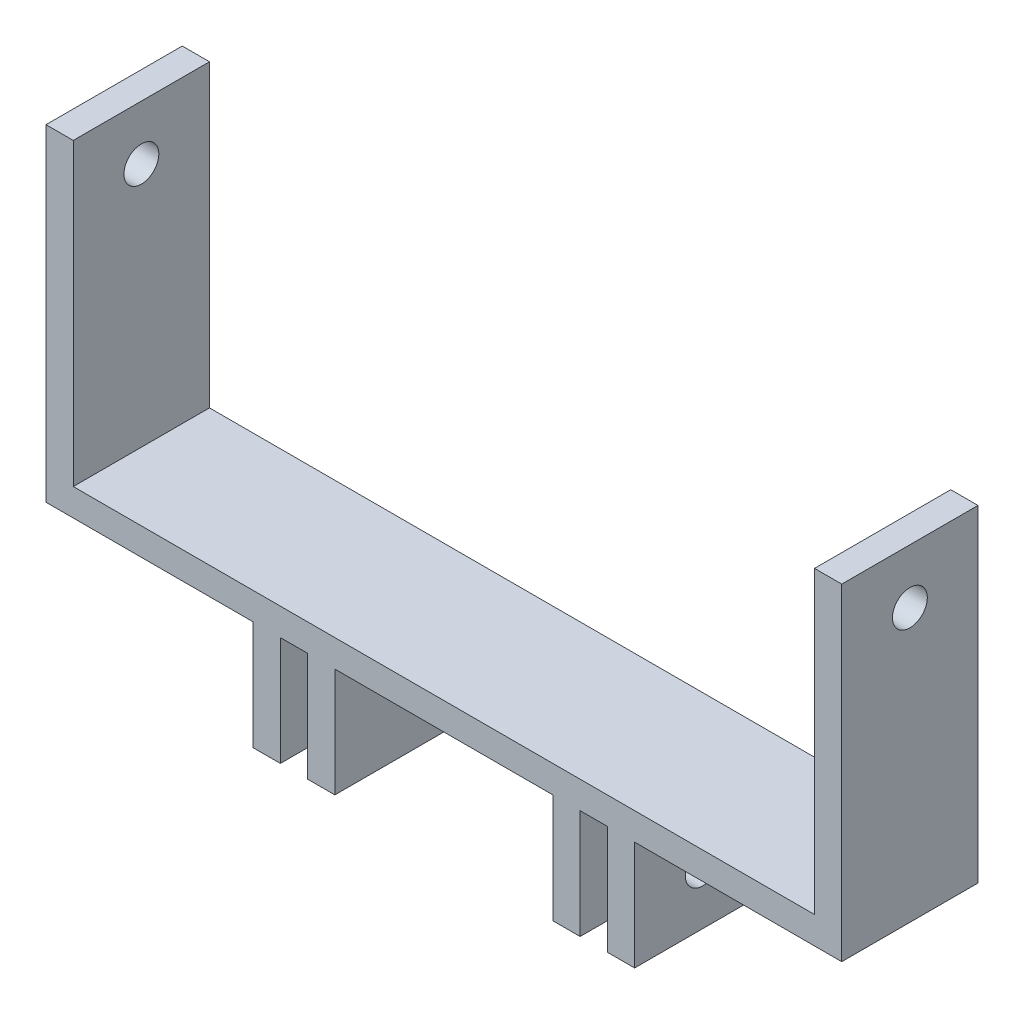
ISO-10303-21;
HEADER;
FILE_DESCRIPTION(('STEP AP214'),'2;1');
FILE_NAME('part.step','',(''),(''),'','','');
FILE_SCHEMA(('AUTOMOTIVE_DESIGN { 1 0 10303 214 1 1 1 1 }'));
ENDSEC;
DATA;
#1=APPLICATION_CONTEXT('core data for automotive mechanical design processes');
#2=APPLICATION_PROTOCOL_DEFINITION('international standard','automotive_design',2000,#1);
#3=PRODUCT_CONTEXT('',#1,'mechanical');
#4=PRODUCT('Part','Part','',(#3));
#5=PRODUCT_RELATED_PRODUCT_CATEGORY('part','',(#4));
#6=PRODUCT_DEFINITION_FORMATION('','',#4);
#7=PRODUCT_DEFINITION_CONTEXT('part definition',#1,'design');
#8=PRODUCT_DEFINITION('design','',#6,#7);
#9=PRODUCT_DEFINITION_SHAPE('','',#8);
#10=(LENGTH_UNIT() NAMED_UNIT(*) SI_UNIT(.MILLI.,.METRE.));
#11=(NAMED_UNIT(*) PLANE_ANGLE_UNIT() SI_UNIT($,.RADIAN.));
#12=(NAMED_UNIT(*) SI_UNIT($,.STERADIAN.) SOLID_ANGLE_UNIT());
#13=UNCERTAINTY_MEASURE_WITH_UNIT(LENGTH_MEASURE(1.E-05),#10,'distance_accuracy_value','');
#14=(GEOMETRIC_REPRESENTATION_CONTEXT(3) GLOBAL_UNCERTAINTY_ASSIGNED_CONTEXT((#13)) GLOBAL_UNIT_ASSIGNED_CONTEXT((#10,
#11,#12)) REPRESENTATION_CONTEXT('',''));
#15=CARTESIAN_POINT('',(0.,0.,0.));
#16=DIRECTION('',(0.,0.,1.));
#17=DIRECTION('',(1.,0.,0.));
#18=AXIS2_PLACEMENT_3D('',#15,#16,#17);
#19=CARTESIAN_POINT('',(92.71,0.,15.875));
#20=DIRECTION('',(1.,0.,0.));
#21=DIRECTION('',(0.,0.,-1.));
#22=AXIS2_PLACEMENT_3D('',#19,#20,#21);
#23=PLANE('',#22);
#24=DIRECTION('',(0.,-1.,0.));
#25=VECTOR('',#24,1.);
#26=CARTESIAN_POINT('',(92.71,0.,0.));
#27=LINE('',#26,#25);
#28=CARTESIAN_POINT('',(92.71,38.1,0.));
#29=VERTEX_POINT('',#28);
#30=CARTESIAN_POINT('',(92.71,0.,0.));
#31=VERTEX_POINT('',#30);
#32=EDGE_CURVE('E301',#29,#31,#27,.T.);
#33=ORIENTED_EDGE('',*,*,#32,.F.);
#34=DIRECTION('',(0.,0.,-1.));
#35=VECTOR('',#34,1.);
#36=CARTESIAN_POINT('',(92.71,38.1,15.875));
#37=LINE('',#36,#35);
#38=CARTESIAN_POINT('',(92.71,38.1,15.875));
#39=VERTEX_POINT('',#38);
#40=EDGE_CURVE('E360',#39,#29,#37,.T.);
#41=ORIENTED_EDGE('',*,*,#40,.F.);
#42=DIRECTION('',(0.,-1.,0.));
#43=VECTOR('',#42,1.);
#44=CARTESIAN_POINT('',(92.71,0.,15.875));
#45=LINE('',#44,#43);
#46=CARTESIAN_POINT('',(92.71,0.,15.875));
#47=VERTEX_POINT('',#46);
#48=EDGE_CURVE('E334',#39,#47,#45,.T.);
#49=ORIENTED_EDGE('',*,*,#48,.T.);
#50=DIRECTION('',(0.,0.,-1.));
#51=VECTOR('',#50,1.);
#52=CARTESIAN_POINT('',(92.71,0.,15.875));
#53=LINE('',#52,#51);
#54=EDGE_CURVE('E300',#47,#31,#53,.T.);
#55=ORIENTED_EDGE('',*,*,#54,.T.);
#56=EDGE_LOOP('',(#33,#41,#49,#55));
#57=FACE_BOUND('',#56,.T.);
#58=CARTESIAN_POINT('',(92.71,31.75,7.93749999999999));
#59=DIRECTION('',(-1.,0.,0.));
#60=DIRECTION('',(0.,0.,1.));
#61=AXIS2_PLACEMENT_3D('',#58,#59,#60);
#62=CIRCLE('',#61,2.032);
#63=CARTESIAN_POINT('',(92.71,31.75,9.96949999999999));
#64=VERTEX_POINT('',#63);
#65=EDGE_CURVE('E761',#64,#64,#62,.T.);
#66=ORIENTED_EDGE('',*,*,#65,.T.);
#67=EDGE_LOOP('',(#66));
#68=FACE_BOUND('',#67,.T.);
#69=ADVANCED_FACE('F35',(#57,#68),#23,.T.);
#70=CARTESIAN_POINT('',(89.535,3.175,15.875));
#71=DIRECTION('',(-1.,0.,0.));
#72=DIRECTION('',(0.,0.,1.));
#73=AXIS2_PLACEMENT_3D('',#70,#71,#72);
#74=PLANE('',#73);
#75=DIRECTION('',(0.,1.,0.));
#76=VECTOR('',#75,1.);
#77=CARTESIAN_POINT('',(89.535,3.175,0.));
#78=LINE('',#77,#76);
#79=CARTESIAN_POINT('',(89.535,3.175,0.));
#80=VERTEX_POINT('',#79);
#81=CARTESIAN_POINT('',(89.535,38.1,0.));
#82=VERTEX_POINT('',#81);
#83=EDGE_CURVE('E308',#80,#82,#78,.T.);
#84=ORIENTED_EDGE('',*,*,#83,.F.);
#85=DIRECTION('',(0.,0.,-1.));
#86=VECTOR('',#85,1.);
#87=CARTESIAN_POINT('',(89.535,3.175,15.875));
#88=LINE('',#87,#86);
#89=CARTESIAN_POINT('',(89.535,3.175,15.875));
#90=VERTEX_POINT('',#89);
#91=EDGE_CURVE('E269',#90,#80,#88,.T.);
#92=ORIENTED_EDGE('',*,*,#91,.F.);
#93=DIRECTION('',(0.,1.,0.));
#94=VECTOR('',#93,1.);
#95=CARTESIAN_POINT('',(89.535,3.175,15.875));
#96=LINE('',#95,#94);
#97=CARTESIAN_POINT('',(89.535,38.1,15.875));
#98=VERTEX_POINT('',#97);
#99=EDGE_CURVE('E145',#90,#98,#96,.T.);
#100=ORIENTED_EDGE('',*,*,#99,.T.);
#101=DIRECTION('',(0.,0.,-1.));
#102=VECTOR('',#101,1.);
#103=CARTESIAN_POINT('',(89.535,38.1,15.875));
#104=LINE('',#103,#102);
#105=EDGE_CURVE('E357',#98,#82,#104,.T.);
#106=ORIENTED_EDGE('',*,*,#105,.T.);
#107=EDGE_LOOP('',(#84,#92,#100,#106));
#108=FACE_BOUND('',#107,.T.);
#109=CARTESIAN_POINT('',(89.535,31.75,7.93749999999999));
#110=DIRECTION('',(-1.,0.,0.));
#111=DIRECTION('',(0.,0.,1.));
#112=AXIS2_PLACEMENT_3D('',#109,#110,#111);
#113=CIRCLE('',#112,2.032);
#114=CARTESIAN_POINT('',(89.535,31.75,9.96949999999999));
#115=VERTEX_POINT('',#114);
#116=EDGE_CURVE('E681',#115,#115,#113,.T.);
#117=ORIENTED_EDGE('',*,*,#116,.F.);
#118=EDGE_LOOP('',(#117));
#119=FACE_BOUND('',#118,.T.);
#120=ADVANCED_FACE('F389',(#108,#119),#74,.T.);
#121=CARTESIAN_POINT('',(65.405,-12.7,15.875));
#122=DIRECTION('',(-1.,0.,0.));
#123=DIRECTION('',(0.,-1.,0.));
#124=AXIS2_PLACEMENT_3D('',#121,#122,#123);
#125=PLANE('',#124);
#126=DIRECTION('',(0.,1.,0.));
#127=VECTOR('',#126,1.);
#128=CARTESIAN_POINT('',(65.405,-12.7,0.));
#129=LINE('',#128,#127);
#130=CARTESIAN_POINT('',(65.405,-12.7,0.));
#131=VERTEX_POINT('',#130);
#132=CARTESIAN_POINT('',(65.405,0.,0.));
#133=VERTEX_POINT('',#132);
#134=EDGE_CURVE('E322',#131,#133,#129,.T.);
#135=ORIENTED_EDGE('',*,*,#134,.F.);
#136=DIRECTION('',(0.,0.,-1.));
#137=VECTOR('',#136,1.);
#138=CARTESIAN_POINT('',(65.405,-12.7,15.875));
#139=LINE('',#138,#137);
#140=CARTESIAN_POINT('',(65.405,-12.7,15.875));
#141=VERTEX_POINT('',#140);
#142=EDGE_CURVE('E343',#141,#131,#139,.T.);
#143=ORIENTED_EDGE('',*,*,#142,.F.);
#144=DIRECTION('',(0.,1.,0.));
#145=VECTOR('',#144,1.);
#146=CARTESIAN_POINT('',(65.405,-12.7,15.875));
#147=LINE('',#146,#145);
#148=CARTESIAN_POINT('',(65.405,0.,15.875));
#149=VERTEX_POINT('',#148);
#150=EDGE_CURVE('E288',#141,#149,#147,.T.);
#151=ORIENTED_EDGE('',*,*,#150,.T.);
#152=DIRECTION('',(0.,0.,-1.));
#153=VECTOR('',#152,1.);
#154=CARTESIAN_POINT('',(65.405,0.,15.875));
#155=LINE('',#154,#153);
#156=EDGE_CURVE('E346',#149,#133,#155,.T.);
#157=ORIENTED_EDGE('',*,*,#156,.T.);
#158=EDGE_LOOP('',(#135,#143,#151,#157));
#159=FACE_BOUND('',#158,.T.);
#160=CARTESIAN_POINT('',(65.405,-6.35,7.9375));
#161=DIRECTION('',(-1.,0.,0.));
#162=DIRECTION('',(0.,-1.,0.));
#163=AXIS2_PLACEMENT_3D('',#160,#161,#162);
#164=CIRCLE('',#163,2.032);
#165=CARTESIAN_POINT('',(65.405,-8.382,7.9375));
#166=VERTEX_POINT('',#165);
#167=EDGE_CURVE('E678',#166,#166,#164,.T.);
#168=ORIENTED_EDGE('',*,*,#167,.F.);
#169=EDGE_LOOP('',(#168));
#170=FACE_BOUND('',#169,.T.);
#171=ADVANCED_FACE('F395',(#159,#170),#125,.T.);
#172=CARTESIAN_POINT('',(68.58,0.,15.875));
#173=DIRECTION('',(1.,0.,0.));
#174=DIRECTION('',(0.,0.,-1.));
#175=AXIS2_PLACEMENT_3D('',#172,#173,#174);
#176=PLANE('',#175);
#177=DIRECTION('',(0.,-1.,0.));
#178=VECTOR('',#177,1.);
#179=CARTESIAN_POINT('',(68.58,0.,0.));
#180=LINE('',#179,#178);
#181=CARTESIAN_POINT('',(68.58,0.,0.));
#182=VERTEX_POINT('',#181);
#183=CARTESIAN_POINT('',(68.58,-12.7,0.));
#184=VERTEX_POINT('',#183);
#185=EDGE_CURVE('E328',#182,#184,#180,.T.);
#186=ORIENTED_EDGE('',*,*,#185,.F.);
#187=DIRECTION('',(0.,0.,-1.));
#188=VECTOR('',#187,1.);
#189=CARTESIAN_POINT('',(68.58,0.,15.875));
#190=LINE('',#189,#188);
#191=CARTESIAN_POINT('',(68.58,0.,15.875));
#192=VERTEX_POINT('',#191);
#193=EDGE_CURVE('E337',#192,#182,#190,.T.);
#194=ORIENTED_EDGE('',*,*,#193,.F.);
#195=DIRECTION('',(0.,-1.,0.));
#196=VECTOR('',#195,1.);
#197=CARTESIAN_POINT('',(68.58,0.,15.875));
#198=LINE('',#197,#196);
#199=CARTESIAN_POINT('',(68.58,-12.7,15.875));
#200=VERTEX_POINT('',#199);
#201=EDGE_CURVE('E294',#192,#200,#198,.T.);
#202=ORIENTED_EDGE('',*,*,#201,.T.);
#203=DIRECTION('',(0.,0.,-1.));
#204=VECTOR('',#203,1.);
#205=CARTESIAN_POINT('',(68.58,-12.7,15.875));
#206=LINE('',#205,#204);
#207=EDGE_CURVE('E340',#200,#184,#206,.T.);
#208=ORIENTED_EDGE('',*,*,#207,.T.);
#209=EDGE_LOOP('',(#186,#194,#202,#208));
#210=FACE_BOUND('',#209,.T.);
#211=CARTESIAN_POINT('',(68.58,-6.35,7.9375));
#212=DIRECTION('',(-1.,0.,0.));
#213=DIRECTION('',(0.,-1.,0.));
#214=AXIS2_PLACEMENT_3D('',#211,#212,#213);
#215=CIRCLE('',#214,2.032);
#216=CARTESIAN_POINT('',(68.58,-8.382,7.9375));
#217=VERTEX_POINT('',#216);
#218=EDGE_CURVE('E305',#217,#217,#215,.T.);
#219=ORIENTED_EDGE('',*,*,#218,.T.);
#220=EDGE_LOOP('',(#219));
#221=FACE_BOUND('',#220,.T.);
#222=ADVANCED_FACE('F386',(#210,#221),#176,.T.);
#223=CARTESIAN_POINT('',(0.,0.,15.875));
#224=DIRECTION('',(1.,0.,0.));
#225=DIRECTION('',(0.,0.,-1.));
#226=AXIS2_PLACEMENT_3D('',#223,#224,#225);
#227=PLANE('',#226);
#228=CARTESIAN_POINT('',(0.,31.75,7.93749999999999));
#229=DIRECTION('',(-1.,0.,0.));
#230=DIRECTION('',(0.,0.,1.));
#231=AXIS2_PLACEMENT_3D('',#228,#229,#230);
#232=CIRCLE('',#231,2.032);
#233=CARTESIAN_POINT('',(0.,31.75,9.96949999999999));
#234=VERTEX_POINT('',#233);
#235=EDGE_CURVE('E363',#234,#234,#232,.T.);
#236=ORIENTED_EDGE('',*,*,#235,.F.);
#237=EDGE_LOOP('',(#236));
#238=FACE_BOUND('',#237,.T.);
#239=DIRECTION('',(0.,-1.,0.));
#240=VECTOR('',#239,1.);
#241=CARTESIAN_POINT('',(0.,0.,0.));
#242=LINE('',#241,#240);
#243=CARTESIAN_POINT('',(0.,38.1,0.));
#244=VERTEX_POINT('',#243);
#245=CARTESIAN_POINT('',(0.,0.,0.));
#246=VERTEX_POINT('',#245);
#247=EDGE_CURVE('E164',#244,#246,#242,.T.);
#248=ORIENTED_EDGE('',*,*,#247,.T.);
#249=DIRECTION('',(0.,0.,-1.));
#250=VECTOR('',#249,1.);
#251=CARTESIAN_POINT('',(0.,0.,15.875));
#252=LINE('',#251,#250);
#253=CARTESIAN_POINT('',(0.,0.,15.875));
#254=VERTEX_POINT('',#253);
#255=EDGE_CURVE('E11',#254,#246,#252,.T.);
#256=ORIENTED_EDGE('',*,*,#255,.F.);
#257=DIRECTION('',(0.,-1.,0.));
#258=VECTOR('',#257,1.);
#259=CARTESIAN_POINT('',(0.,0.,15.875));
#260=LINE('',#259,#258);
#261=CARTESIAN_POINT('',(0.,38.1,15.875));
#262=VERTEX_POINT('',#261);
#263=EDGE_CURVE('E190',#262,#254,#260,.T.);
#264=ORIENTED_EDGE('',*,*,#263,.F.);
#265=DIRECTION('',(0.,0.,-1.));
#266=VECTOR('',#265,1.);
#267=CARTESIAN_POINT('',(0.,38.1,15.875));
#268=LINE('',#267,#266);
#269=EDGE_CURVE('E160',#262,#244,#268,.T.);
#270=ORIENTED_EDGE('',*,*,#269,.T.);
#271=EDGE_LOOP('',(#248,#256,#264,#270));
#272=FACE_BOUND('',#271,.T.);
#273=ADVANCED_FACE('F37',(#238,#272),#227,.F.);
#274=CARTESIAN_POINT('',(0.,0.,15.875));
#275=DIRECTION('',(0.,1.,0.));
#276=DIRECTION('',(0.,0.,1.));
#277=AXIS2_PLACEMENT_3D('',#274,#275,#276);
#278=PLANE('',#277);
#279=DIRECTION('',(1.,0.,0.));
#280=VECTOR('',#279,1.);
#281=CARTESIAN_POINT('',(0.,0.,0.));
#282=LINE('',#281,#280);
#283=CARTESIAN_POINT('',(24.13,0.,0.));
#284=VERTEX_POINT('',#283);
#285=EDGE_CURVE('E167',#246,#284,#282,.T.);
#286=ORIENTED_EDGE('',*,*,#285,.T.);
#287=DIRECTION('',(0.,0.,-1.));
#288=VECTOR('',#287,1.);
#289=CARTESIAN_POINT('',(24.13,0.,15.875));
#290=LINE('',#289,#288);
#291=CARTESIAN_POINT('',(24.13,0.,15.875));
#292=VERTEX_POINT('',#291);
#293=EDGE_CURVE('E44',#292,#284,#290,.T.);
#294=ORIENTED_EDGE('',*,*,#293,.F.);
#295=DIRECTION('',(1.,0.,0.));
#296=VECTOR('',#295,1.);
#297=CARTESIAN_POINT('',(0.,0.,15.875));
#298=LINE('',#297,#296);
#299=EDGE_CURVE('E108',#254,#292,#298,.T.);
#300=ORIENTED_EDGE('',*,*,#299,.F.);
#301=ORIENTED_EDGE('',*,*,#255,.T.);
#302=EDGE_LOOP('',(#286,#294,#300,#301));
#303=FACE_BOUND('',#302,.T.);
#304=ADVANCED_FACE('F378',(#303),#278,.F.);
#305=CARTESIAN_POINT('',(24.13,0.,15.875));
#306=DIRECTION('',(1.,0.,0.));
#307=DIRECTION('',(0.,0.,-1.));
#308=AXIS2_PLACEMENT_3D('',#305,#306,#307);
#309=PLANE('',#308);
#310=CARTESIAN_POINT('',(24.13,-6.35,7.9375));
#311=DIRECTION('',(-1.,0.,0.));
#312=DIRECTION('',(0.,-1.,0.));
#313=AXIS2_PLACEMENT_3D('',#310,#311,#312);
#314=CIRCLE('',#313,2.032);
#315=CARTESIAN_POINT('',(24.13,-8.382,7.9375));
#316=VERTEX_POINT('',#315);
#317=EDGE_CURVE('E369',#316,#316,#314,.T.);
#318=ORIENTED_EDGE('',*,*,#317,.F.);
#319=EDGE_LOOP('',(#318));
#320=FACE_BOUND('',#319,.T.);
#321=DIRECTION('',(0.,-1.,0.));
#322=VECTOR('',#321,1.);
#323=CARTESIAN_POINT('',(24.13,0.,0.));
#324=LINE('',#323,#322);
#325=CARTESIAN_POINT('',(24.13,-12.7,0.));
#326=VERTEX_POINT('',#325);
#327=EDGE_CURVE('E170',#284,#326,#324,.T.);
#328=ORIENTED_EDGE('',*,*,#327,.T.);
#329=DIRECTION('',(0.,0.,-1.));
#330=VECTOR('',#329,1.);
#331=CARTESIAN_POINT('',(24.13,-12.7,15.875));
#332=LINE('',#331,#330);
#333=CARTESIAN_POINT('',(24.13,-12.7,15.875));
#334=VERTEX_POINT('',#333);
#335=EDGE_CURVE('E210',#334,#326,#332,.T.);
#336=ORIENTED_EDGE('',*,*,#335,.F.);
#337=DIRECTION('',(0.,-1.,0.));
#338=VECTOR('',#337,1.);
#339=CARTESIAN_POINT('',(24.13,0.,15.875));
#340=LINE('',#339,#338);
#341=EDGE_CURVE('E218',#292,#334,#340,.T.);
#342=ORIENTED_EDGE('',*,*,#341,.F.);
#343=ORIENTED_EDGE('',*,*,#293,.T.);
#344=EDGE_LOOP('',(#328,#336,#342,#343));
#345=FACE_BOUND('',#344,.T.);
#346=ADVANCED_FACE('F216',(#320,#345),#309,.F.);
#347=CARTESIAN_POINT('',(27.305,-12.7,15.875));
#348=DIRECTION('',(0.,1.,0.));
#349=DIRECTION('',(0.,0.,1.));
#350=AXIS2_PLACEMENT_3D('',#347,#348,#349);
#351=PLANE('',#350);
#352=DIRECTION('',(1.,0.,0.));
#353=VECTOR('',#352,1.);
#354=CARTESIAN_POINT('',(27.305,-12.7,0.));
#355=LINE('',#354,#353);
#356=CARTESIAN_POINT('',(27.305,-12.7,0.));
#357=VERTEX_POINT('',#356);
#358=EDGE_CURVE('E172',#326,#357,#355,.T.);
#359=ORIENTED_EDGE('',*,*,#358,.T.);
#360=DIRECTION('',(0.,0.,-1.));
#361=VECTOR('',#360,1.);
#362=CARTESIAN_POINT('',(27.305,-12.7,15.875));
#363=LINE('',#362,#361);
#364=CARTESIAN_POINT('',(27.305,-12.7,15.875));
#365=VERTEX_POINT('',#364);
#366=EDGE_CURVE('E207',#365,#357,#363,.T.);
#367=ORIENTED_EDGE('',*,*,#366,.F.);
#368=DIRECTION('',(1.,0.,0.));
#369=VECTOR('',#368,1.);
#370=CARTESIAN_POINT('',(27.305,-12.7,15.875));
#371=LINE('',#370,#369);
#372=EDGE_CURVE('E236',#334,#365,#371,.T.);
#373=ORIENTED_EDGE('',*,*,#372,.F.);
#374=ORIENTED_EDGE('',*,*,#335,.T.);
#375=EDGE_LOOP('',(#359,#367,#373,#374));
#376=FACE_BOUND('',#375,.T.);
#377=ADVANCED_FACE('F227',(#376),#351,.F.);
#378=CARTESIAN_POINT('',(27.305,-12.7,15.875));
#379=DIRECTION('',(-1.,0.,0.));
#380=DIRECTION('',(0.,-1.,0.));
#381=AXIS2_PLACEMENT_3D('',#378,#379,#380);
#382=PLANE('',#381);
#383=CARTESIAN_POINT('',(27.305,-6.35,7.9375));
#384=DIRECTION('',(-1.,0.,0.));
#385=DIRECTION('',(0.,-1.,0.));
#386=AXIS2_PLACEMENT_3D('',#383,#384,#385);
#387=CIRCLE('',#386,2.032);
#388=CARTESIAN_POINT('',(27.305,-8.382,7.9375));
#389=VERTEX_POINT('',#388);
#390=EDGE_CURVE('E168',#389,#389,#387,.F.);
#391=ORIENTED_EDGE('',*,*,#390,.F.);
#392=EDGE_LOOP('',(#391));
#393=FACE_BOUND('',#392,.T.);
#394=DIRECTION('',(0.,1.,0.));
#395=VECTOR('',#394,1.);
#396=CARTESIAN_POINT('',(27.305,-12.7,0.));
#397=LINE('',#396,#395);
#398=CARTESIAN_POINT('',(27.305,0.,0.));
#399=VERTEX_POINT('',#398);
#400=EDGE_CURVE('E174',#357,#399,#397,.T.);
#401=ORIENTED_EDGE('',*,*,#400,.T.);
#402=DIRECTION('',(0.,0.,-1.));
#403=VECTOR('',#402,1.);
#404=CARTESIAN_POINT('',(27.305,0.,15.875));
#405=LINE('',#404,#403);
#406=CARTESIAN_POINT('',(27.305,0.,15.875));
#407=VERTEX_POINT('',#406);
#408=EDGE_CURVE('E204',#407,#399,#405,.T.);
#409=ORIENTED_EDGE('',*,*,#408,.F.);
#410=DIRECTION('',(0.,1.,0.));
#411=VECTOR('',#410,1.);
#412=CARTESIAN_POINT('',(27.305,-12.7,15.875));
#413=LINE('',#412,#411);
#414=EDGE_CURVE('E233',#365,#407,#413,.T.);
#415=ORIENTED_EDGE('',*,*,#414,.F.);
#416=ORIENTED_EDGE('',*,*,#366,.T.);
#417=EDGE_LOOP('',(#401,#409,#415,#416));
#418=FACE_BOUND('',#417,.T.);
#419=ADVANCED_FACE('F231',(#393,#418),#382,.F.);
#420=CARTESIAN_POINT('',(27.305,0.,15.875));
#421=DIRECTION('',(0.,1.,0.));
#422=DIRECTION('',(0.,0.,1.));
#423=AXIS2_PLACEMENT_3D('',#420,#421,#422);
#424=PLANE('',#423);
#425=DIRECTION('',(1.,0.,0.));
#426=VECTOR('',#425,1.);
#427=CARTESIAN_POINT('',(27.305,0.,0.));
#428=LINE('',#427,#426);
#429=CARTESIAN_POINT('',(30.48,0.,0.));
#430=VERTEX_POINT('',#429);
#431=EDGE_CURVE('E176',#399,#430,#428,.T.);
#432=ORIENTED_EDGE('',*,*,#431,.T.);
#433=DIRECTION('',(0.,0.,-1.));
#434=VECTOR('',#433,1.);
#435=CARTESIAN_POINT('',(30.48,0.,15.875));
#436=LINE('',#435,#434);
#437=CARTESIAN_POINT('',(30.48,0.,15.875));
#438=VERTEX_POINT('',#437);
#439=EDGE_CURVE('E201',#438,#430,#436,.T.);
#440=ORIENTED_EDGE('',*,*,#439,.F.);
#441=DIRECTION('',(1.,0.,0.));
#442=VECTOR('',#441,1.);
#443=CARTESIAN_POINT('',(27.305,0.,15.875));
#444=LINE('',#443,#442);
#445=EDGE_CURVE('E235',#407,#438,#444,.T.);
#446=ORIENTED_EDGE('',*,*,#445,.F.);
#447=ORIENTED_EDGE('',*,*,#408,.T.);
#448=EDGE_LOOP('',(#432,#440,#446,#447));
#449=FACE_BOUND('',#448,.T.);
#450=ADVANCED_FACE('F436',(#449),#424,.F.);
#451=CARTESIAN_POINT('',(30.48,-12.7,15.875));
#452=DIRECTION('',(1.,0.,0.));
#453=DIRECTION('',(0.,1.,0.));
#454=AXIS2_PLACEMENT_3D('',#451,#452,#453);
#455=PLANE('',#454);
#456=DIRECTION('',(0.,-1.,0.));
#457=VECTOR('',#456,1.);
#458=CARTESIAN_POINT('',(30.48,-12.7,0.));
#459=LINE('',#458,#457);
#460=CARTESIAN_POINT('',(30.48,-12.7,0.));
#461=VERTEX_POINT('',#460);
#462=EDGE_CURVE('E178',#430,#461,#459,.T.);
#463=ORIENTED_EDGE('',*,*,#462,.T.);
#464=DIRECTION('',(0.,0.,-1.));
#465=VECTOR('',#464,1.);
#466=CARTESIAN_POINT('',(30.48,-12.7,15.875));
#467=LINE('',#466,#465);
#468=CARTESIAN_POINT('',(30.48,-12.7,15.875));
#469=VERTEX_POINT('',#468);
#470=EDGE_CURVE('E198',#469,#461,#467,.T.);
#471=ORIENTED_EDGE('',*,*,#470,.F.);
#472=DIRECTION('',(0.,-1.,0.));
#473=VECTOR('',#472,1.);
#474=CARTESIAN_POINT('',(30.48,-12.7,15.875));
#475=LINE('',#474,#473);
#476=EDGE_CURVE('E238',#438,#469,#475,.T.);
#477=ORIENTED_EDGE('',*,*,#476,.F.);
#478=ORIENTED_EDGE('',*,*,#439,.T.);
#479=EDGE_LOOP('',(#463,#471,#477,#478));
#480=FACE_BOUND('',#479,.T.);
#481=ADVANCED_FACE('F432',(#480),#455,.F.);
#482=CARTESIAN_POINT('',(30.48,-12.7,15.875));
#483=DIRECTION('',(0.,1.,0.));
#484=DIRECTION('',(0.,0.,1.));
#485=AXIS2_PLACEMENT_3D('',#482,#483,#484);
#486=PLANE('',#485);
#487=DIRECTION('',(1.,0.,0.));
#488=VECTOR('',#487,1.);
#489=CARTESIAN_POINT('',(30.48,-12.7,0.));
#490=LINE('',#489,#488);
#491=CARTESIAN_POINT('',(33.655,-12.7,0.));
#492=VERTEX_POINT('',#491);
#493=EDGE_CURVE('E180',#461,#492,#490,.T.);
#494=ORIENTED_EDGE('',*,*,#493,.T.);
#495=DIRECTION('',(0.,0.,-1.));
#496=VECTOR('',#495,1.);
#497=CARTESIAN_POINT('',(33.655,-12.7,15.875));
#498=LINE('',#497,#496);
#499=CARTESIAN_POINT('',(33.655,-12.7,15.875));
#500=VERTEX_POINT('',#499);
#501=EDGE_CURVE('E195',#500,#492,#498,.T.);
#502=ORIENTED_EDGE('',*,*,#501,.F.);
#503=DIRECTION('',(1.,0.,0.));
#504=VECTOR('',#503,1.);
#505=CARTESIAN_POINT('',(30.48,-12.7,15.875));
#506=LINE('',#505,#504);
#507=EDGE_CURVE('E244',#469,#500,#506,.T.);
#508=ORIENTED_EDGE('',*,*,#507,.F.);
#509=ORIENTED_EDGE('',*,*,#470,.T.);
#510=EDGE_LOOP('',(#494,#502,#508,#509));
#511=FACE_BOUND('',#510,.T.);
#512=ADVANCED_FACE('F428',(#511),#486,.F.);
#513=CARTESIAN_POINT('',(33.655,-12.7,15.875));
#514=DIRECTION('',(-1.,0.,0.));
#515=DIRECTION('',(0.,-1.,0.));
#516=AXIS2_PLACEMENT_3D('',#513,#514,#515);
#517=PLANE('',#516);
#518=DIRECTION('',(0.,1.,0.));
#519=VECTOR('',#518,1.);
#520=CARTESIAN_POINT('',(33.655,-12.7,0.));
#521=LINE('',#520,#519);
#522=CARTESIAN_POINT('',(33.655,0.,0.));
#523=VERTEX_POINT('',#522);
#524=EDGE_CURVE('E182',#492,#523,#521,.T.);
#525=ORIENTED_EDGE('',*,*,#524,.T.);
#526=DIRECTION('',(0.,0.,-1.));
#527=VECTOR('',#526,1.);
#528=CARTESIAN_POINT('',(33.655,0.,15.875));
#529=LINE('',#528,#527);
#530=CARTESIAN_POINT('',(33.655,0.,15.875));
#531=VERTEX_POINT('',#530);
#532=EDGE_CURVE('E155',#531,#523,#529,.T.);
#533=ORIENTED_EDGE('',*,*,#532,.F.);
#534=DIRECTION('',(0.,1.,0.));
#535=VECTOR('',#534,1.);
#536=CARTESIAN_POINT('',(33.655,-12.7,15.875));
#537=LINE('',#536,#535);
#538=EDGE_CURVE('E246',#500,#531,#537,.T.);
#539=ORIENTED_EDGE('',*,*,#538,.F.);
#540=ORIENTED_EDGE('',*,*,#501,.T.);
#541=EDGE_LOOP('',(#525,#533,#539,#540));
#542=FACE_BOUND('',#541,.T.);
#543=ADVANCED_FACE('F425',(#542),#517,.F.);
#544=CARTESIAN_POINT('',(33.655,0.,15.875));
#545=DIRECTION('',(0.,1.,0.));
#546=DIRECTION('',(0.,0.,1.));
#547=AXIS2_PLACEMENT_3D('',#544,#545,#546);
#548=PLANE('',#547);
#549=DIRECTION('',(1.,0.,0.));
#550=VECTOR('',#549,1.);
#551=CARTESIAN_POINT('',(33.655,0.,0.));
#552=LINE('',#551,#550);
#553=CARTESIAN_POINT('',(59.055,0.,0.));
#554=VERTEX_POINT('',#553);
#555=EDGE_CURVE('E184',#523,#554,#552,.T.);
#556=ORIENTED_EDGE('',*,*,#555,.T.);
#557=DIRECTION('',(0.,0.,-1.));
#558=VECTOR('',#557,1.);
#559=CARTESIAN_POINT('',(59.055,0.,15.875));
#560=LINE('',#559,#558);
#561=CARTESIAN_POINT('',(59.055,0.,15.875));
#562=VERTEX_POINT('',#561);
#563=EDGE_CURVE('E262',#562,#554,#560,.T.);
#564=ORIENTED_EDGE('',*,*,#563,.F.);
#565=DIRECTION('',(1.,0.,0.));
#566=VECTOR('',#565,1.);
#567=CARTESIAN_POINT('',(33.655,0.,15.875));
#568=LINE('',#567,#566);
#569=EDGE_CURVE('E149',#531,#562,#568,.T.);
#570=ORIENTED_EDGE('',*,*,#569,.F.);
#571=ORIENTED_EDGE('',*,*,#532,.T.);
#572=EDGE_LOOP('',(#556,#564,#570,#571));
#573=FACE_BOUND('',#572,.T.);
#574=ADVANCED_FACE('F263',(#573),#548,.F.);
#575=CARTESIAN_POINT('',(3.175,3.175,15.875));
#576=DIRECTION('',(0.,-1.,0.));
#577=DIRECTION('',(0.,0.,-1.));
#578=AXIS2_PLACEMENT_3D('',#575,#576,#577);
#579=PLANE('',#578);
#580=DIRECTION('',(-1.,0.,0.));
#581=VECTOR('',#580,1.);
#582=CARTESIAN_POINT('',(3.175,3.175,0.));
#583=LINE('',#582,#581);
#584=CARTESIAN_POINT('',(3.175,3.175,0.));
#585=VERTEX_POINT('',#584);
#586=EDGE_CURVE('E154',#80,#585,#583,.T.);
#587=ORIENTED_EDGE('',*,*,#586,.T.);
#588=DIRECTION('',(0.,0.,-1.));
#589=VECTOR('',#588,1.);
#590=CARTESIAN_POINT('',(3.175,3.175,15.875));
#591=LINE('',#590,#589);
#592=CARTESIAN_POINT('',(3.175,3.175,15.875));
#593=VERTEX_POINT('',#592);
#594=EDGE_CURVE('E151',#593,#585,#591,.T.);
#595=ORIENTED_EDGE('',*,*,#594,.F.);
#596=DIRECTION('',(-1.,0.,0.));
#597=VECTOR('',#596,1.);
#598=CARTESIAN_POINT('',(3.175,3.175,15.875));
#599=LINE('',#598,#597);
#600=EDGE_CURVE('E137',#90,#593,#599,.T.);
#601=ORIENTED_EDGE('',*,*,#600,.F.);
#602=ORIENTED_EDGE('',*,*,#91,.T.);
#603=EDGE_LOOP('',(#587,#595,#601,#602));
#604=FACE_BOUND('',#603,.T.);
#605=ADVANCED_FACE('F152',(#604),#579,.F.);
#606=CARTESIAN_POINT('',(3.175,3.175,15.875));
#607=DIRECTION('',(-1.,0.,0.));
#608=DIRECTION('',(0.,0.,1.));
#609=AXIS2_PLACEMENT_3D('',#606,#607,#608);
#610=PLANE('',#609);
#611=CARTESIAN_POINT('',(3.175,31.75,7.93749999999999));
#612=DIRECTION('',(-1.,0.,0.));
#613=DIRECTION('',(0.,0.,1.));
#614=AXIS2_PLACEMENT_3D('',#611,#612,#613);
#615=CIRCLE('',#614,2.032);
#616=CARTESIAN_POINT('',(3.175,31.75,9.96949999999999));
#617=VERTEX_POINT('',#616);
#618=EDGE_CURVE('E366',#617,#617,#615,.F.);
#619=ORIENTED_EDGE('',*,*,#618,.F.);
#620=EDGE_LOOP('',(#619));
#621=FACE_BOUND('',#620,.T.);
#622=DIRECTION('',(0.,1.,0.));
#623=VECTOR('',#622,1.);
#624=CARTESIAN_POINT('',(3.175,3.175,0.));
#625=LINE('',#624,#623);
#626=CARTESIAN_POINT('',(3.175,38.1,0.));
#627=VERTEX_POINT('',#626);
#628=EDGE_CURVE('E94',#585,#627,#625,.T.);
#629=ORIENTED_EDGE('',*,*,#628,.T.);
#630=DIRECTION('',(0.,0.,-1.));
#631=VECTOR('',#630,1.);
#632=CARTESIAN_POINT('',(3.175,38.1,15.875));
#633=LINE('',#632,#631);
#634=CARTESIAN_POINT('',(3.175,38.1,15.875));
#635=VERTEX_POINT('',#634);
#636=EDGE_CURVE('E156',#635,#627,#633,.T.);
#637=ORIENTED_EDGE('',*,*,#636,.F.);
#638=DIRECTION('',(0.,1.,0.));
#639=VECTOR('',#638,1.);
#640=CARTESIAN_POINT('',(3.175,3.175,15.875));
#641=LINE('',#640,#639);
#642=EDGE_CURVE('E141',#593,#635,#641,.T.);
#643=ORIENTED_EDGE('',*,*,#642,.F.);
#644=ORIENTED_EDGE('',*,*,#594,.T.);
#645=EDGE_LOOP('',(#629,#637,#643,#644));
#646=FACE_BOUND('',#645,.T.);
#647=ADVANCED_FACE('F158',(#621,#646),#610,.F.);
#648=CARTESIAN_POINT('',(0.,38.1,15.875));
#649=DIRECTION('',(0.,-1.,0.));
#650=DIRECTION('',(0.,0.,-1.));
#651=AXIS2_PLACEMENT_3D('',#648,#649,#650);
#652=PLANE('',#651);
#653=DIRECTION('',(-1.,0.,0.));
#654=VECTOR('',#653,1.);
#655=CARTESIAN_POINT('',(0.,38.1,0.));
#656=LINE('',#655,#654);
#657=EDGE_CURVE('E100',#627,#244,#656,.T.);
#658=ORIENTED_EDGE('',*,*,#657,.T.);
#659=ORIENTED_EDGE('',*,*,#269,.F.);
#660=DIRECTION('',(-1.,0.,0.));
#661=VECTOR('',#660,1.);
#662=CARTESIAN_POINT('',(0.,38.1,15.875));
#663=LINE('',#662,#661);
#664=EDGE_CURVE('E52',#635,#262,#663,.T.);
#665=ORIENTED_EDGE('',*,*,#664,.F.);
#666=ORIENTED_EDGE('',*,*,#636,.T.);
#667=EDGE_LOOP('',(#658,#659,#665,#666));
#668=FACE_BOUND('',#667,.T.);
#669=ADVANCED_FACE('F413',(#668),#652,.F.);
#670=CARTESIAN_POINT('',(0.,0.,15.875));
#671=DIRECTION('',(0.,0.,-1.));
#672=DIRECTION('',(-1.,0.,0.));
#673=AXIS2_PLACEMENT_3D('',#670,#671,#672);
#674=PLANE('',#673);
#675=ORIENTED_EDGE('',*,*,#263,.T.);
#676=ORIENTED_EDGE('',*,*,#299,.T.);
#677=ORIENTED_EDGE('',*,*,#341,.T.);
#678=ORIENTED_EDGE('',*,*,#372,.T.);
#679=ORIENTED_EDGE('',*,*,#414,.T.);
#680=ORIENTED_EDGE('',*,*,#445,.T.);
#681=ORIENTED_EDGE('',*,*,#476,.T.);
#682=ORIENTED_EDGE('',*,*,#507,.T.);
#683=ORIENTED_EDGE('',*,*,#538,.T.);
#684=ORIENTED_EDGE('',*,*,#569,.T.);
#685=DIRECTION('',(0.,1.,0.));
#686=VECTOR('',#685,1.);
#687=CARTESIAN_POINT('',(59.055,-12.7,15.875));
#688=LINE('',#687,#686);
#689=CARTESIAN_POINT('',(59.055,-12.7,15.875));
#690=VERTEX_POINT('',#689);
#691=EDGE_CURVE('E255',#690,#562,#688,.T.);
#692=ORIENTED_EDGE('',*,*,#691,.F.);
#693=DIRECTION('',(-1.,0.,0.));
#694=VECTOR('',#693,1.);
#695=CARTESIAN_POINT('',(62.23,-12.7,15.875));
#696=LINE('',#695,#694);
#697=CARTESIAN_POINT('',(62.23,-12.7,15.875));
#698=VERTEX_POINT('',#697);
#699=EDGE_CURVE('E275',#698,#690,#696,.T.);
#700=ORIENTED_EDGE('',*,*,#699,.F.);
#701=DIRECTION('',(0.,-1.,0.));
#702=VECTOR('',#701,1.);
#703=CARTESIAN_POINT('',(62.23,-12.7,15.875));
#704=LINE('',#703,#702);
#705=CARTESIAN_POINT('',(62.23,0.,15.875));
#706=VERTEX_POINT('',#705);
#707=EDGE_CURVE('E277',#706,#698,#704,.T.);
#708=ORIENTED_EDGE('',*,*,#707,.F.);
#709=DIRECTION('',(-1.,0.,0.));
#710=VECTOR('',#709,1.);
#711=CARTESIAN_POINT('',(65.405,0.,15.875));
#712=LINE('',#711,#710);
#713=EDGE_CURVE('E285',#149,#706,#712,.T.);
#714=ORIENTED_EDGE('',*,*,#713,.F.);
#715=ORIENTED_EDGE('',*,*,#150,.F.);
#716=DIRECTION('',(-1.,0.,0.));
#717=VECTOR('',#716,1.);
#718=CARTESIAN_POINT('',(65.405,-12.7,15.875));
#719=LINE('',#718,#717);
#720=EDGE_CURVE('E291',#200,#141,#719,.T.);
#721=ORIENTED_EDGE('',*,*,#720,.F.);
#722=ORIENTED_EDGE('',*,*,#201,.F.);
#723=DIRECTION('',(-1.,0.,0.));
#724=VECTOR('',#723,1.);
#725=CARTESIAN_POINT('',(92.71,0.,15.875));
#726=LINE('',#725,#724);
#727=EDGE_CURVE('E297',#47,#192,#726,.T.);
#728=ORIENTED_EDGE('',*,*,#727,.F.);
#729=ORIENTED_EDGE('',*,*,#48,.F.);
#730=DIRECTION('',(1.,0.,0.));
#731=VECTOR('',#730,1.);
#732=CARTESIAN_POINT('',(92.71,38.1,15.875));
#733=LINE('',#732,#731);
#734=EDGE_CURVE('E279',#98,#39,#733,.T.);
#735=ORIENTED_EDGE('',*,*,#734,.F.);
#736=ORIENTED_EDGE('',*,*,#99,.F.);
#737=ORIENTED_EDGE('',*,*,#600,.T.);
#738=ORIENTED_EDGE('',*,*,#642,.T.);
#739=ORIENTED_EDGE('',*,*,#664,.T.);
#740=EDGE_LOOP('',(#675,#676,#677,#678,#679,#680,#681,#682,#683,#684,#692,#700,#708,#714,#715,
#721,#722,#728,#729,#735,#736,#737,#738,#739));
#741=FACE_BOUND('',#740,.T.);
#742=ADVANCED_FACE('F139',(#741),#674,.F.);
#743=CARTESIAN_POINT('',(0.,0.,0.));
#744=DIRECTION('',(0.,0.,-1.));
#745=DIRECTION('',(-1.,0.,0.));
#746=AXIS2_PLACEMENT_3D('',#743,#744,#745);
#747=PLANE('',#746);
#748=ORIENTED_EDGE('',*,*,#247,.F.);
#749=ORIENTED_EDGE('',*,*,#657,.F.);
#750=ORIENTED_EDGE('',*,*,#628,.F.);
#751=ORIENTED_EDGE('',*,*,#586,.F.);
#752=ORIENTED_EDGE('',*,*,#83,.T.);
#753=DIRECTION('',(1.,0.,0.));
#754=VECTOR('',#753,1.);
#755=CARTESIAN_POINT('',(92.71,38.1,0.));
#756=LINE('',#755,#754);
#757=EDGE_CURVE('E304',#82,#29,#756,.T.);
#758=ORIENTED_EDGE('',*,*,#757,.T.);
#759=ORIENTED_EDGE('',*,*,#32,.T.);
#760=DIRECTION('',(-1.,0.,0.));
#761=VECTOR('',#760,1.);
#762=CARTESIAN_POINT('',(92.71,0.,0.));
#763=LINE('',#762,#761);
#764=EDGE_CURVE('E331',#31,#182,#763,.T.);
#765=ORIENTED_EDGE('',*,*,#764,.T.);
#766=ORIENTED_EDGE('',*,*,#185,.T.);
#767=DIRECTION('',(-1.,0.,0.));
#768=VECTOR('',#767,1.);
#769=CARTESIAN_POINT('',(65.405,-12.7,0.));
#770=LINE('',#769,#768);
#771=EDGE_CURVE('E325',#184,#131,#770,.T.);
#772=ORIENTED_EDGE('',*,*,#771,.T.);
#773=ORIENTED_EDGE('',*,*,#134,.T.);
#774=DIRECTION('',(-1.,0.,0.));
#775=VECTOR('',#774,1.);
#776=CARTESIAN_POINT('',(65.405,0.,0.));
#777=LINE('',#776,#775);
#778=CARTESIAN_POINT('',(62.23,0.,0.));
#779=VERTEX_POINT('',#778);
#780=EDGE_CURVE('E319',#133,#779,#777,.T.);
#781=ORIENTED_EDGE('',*,*,#780,.T.);
#782=DIRECTION('',(0.,-1.,0.));
#783=VECTOR('',#782,1.);
#784=CARTESIAN_POINT('',(62.23,-12.7,0.));
#785=LINE('',#784,#783);
#786=CARTESIAN_POINT('',(62.23,-12.7,0.));
#787=VERTEX_POINT('',#786);
#788=EDGE_CURVE('E316',#779,#787,#785,.T.);
#789=ORIENTED_EDGE('',*,*,#788,.T.);
#790=DIRECTION('',(-1.,0.,0.));
#791=VECTOR('',#790,1.);
#792=CARTESIAN_POINT('',(62.23,-12.7,0.));
#793=LINE('',#792,#791);
#794=CARTESIAN_POINT('',(59.055,-12.7,0.));
#795=VERTEX_POINT('',#794);
#796=EDGE_CURVE('E313',#787,#795,#793,.T.);
#797=ORIENTED_EDGE('',*,*,#796,.T.);
#798=DIRECTION('',(0.,1.,0.));
#799=VECTOR('',#798,1.);
#800=CARTESIAN_POINT('',(59.055,-12.7,0.));
#801=LINE('',#800,#799);
#802=EDGE_CURVE('E311',#795,#554,#801,.T.);
#803=ORIENTED_EDGE('',*,*,#802,.T.);
#804=ORIENTED_EDGE('',*,*,#555,.F.);
#805=ORIENTED_EDGE('',*,*,#524,.F.);
#806=ORIENTED_EDGE('',*,*,#493,.F.);
#807=ORIENTED_EDGE('',*,*,#462,.F.);
#808=ORIENTED_EDGE('',*,*,#431,.F.);
#809=ORIENTED_EDGE('',*,*,#400,.F.);
#810=ORIENTED_EDGE('',*,*,#358,.F.);
#811=ORIENTED_EDGE('',*,*,#327,.F.);
#812=ORIENTED_EDGE('',*,*,#285,.F.);
#813=EDGE_LOOP('',(#748,#749,#750,#751,#752,#758,#759,#765,#766,#772,#773,#781,#789,#797,#803,
#804,#805,#806,#807,#808,#809,#810,#811,#812));
#814=FACE_BOUND('',#813,.T.);
#815=ADVANCED_FACE('F222',(#814),#747,.T.);
#816=CARTESIAN_POINT('',(46.356,-6.35,7.9375));
#817=DIRECTION('',(-1.,0.,0.));
#818=DIRECTION('',(0.,-1.,0.));
#819=AXIS2_PLACEMENT_3D('',#816,#817,#818);
#820=CYLINDRICAL_SURFACE('',#819,2.032);
#821=ORIENTED_EDGE('',*,*,#317,.T.);
#822=EDGE_LOOP('',(#821));
#823=FACE_BOUND('',#822,.T.);
#824=ORIENTED_EDGE('',*,*,#390,.T.);
#825=EDGE_LOOP('',(#824));
#826=FACE_BOUND('',#825,.T.);
#827=ADVANCED_FACE('F406',(#823,#826),#820,.F.);
#828=CARTESIAN_POINT('',(46.356,31.75,7.93749999999999));
#829=DIRECTION('',(-1.,0.,0.));
#830=DIRECTION('',(0.,0.,1.));
#831=AXIS2_PLACEMENT_3D('',#828,#829,#830);
#832=CYLINDRICAL_SURFACE('',#831,2.032);
#833=ORIENTED_EDGE('',*,*,#235,.T.);
#834=EDGE_LOOP('',(#833));
#835=FACE_BOUND('',#834,.T.);
#836=ORIENTED_EDGE('',*,*,#618,.T.);
#837=EDGE_LOOP('',(#836));
#838=FACE_BOUND('',#837,.T.);
#839=ADVANCED_FACE('F403',(#835,#838),#832,.F.);
#840=CARTESIAN_POINT('',(92.71,38.1,15.875));
#841=DIRECTION('',(0.,1.,0.));
#842=DIRECTION('',(0.,0.,1.));
#843=AXIS2_PLACEMENT_3D('',#840,#841,#842);
#844=PLANE('',#843);
#845=ORIENTED_EDGE('',*,*,#757,.F.);
#846=ORIENTED_EDGE('',*,*,#105,.F.);
#847=ORIENTED_EDGE('',*,*,#734,.T.);
#848=ORIENTED_EDGE('',*,*,#40,.T.);
#849=EDGE_LOOP('',(#845,#846,#847,#848));
#850=FACE_BOUND('',#849,.T.);
#851=ADVANCED_FACE('F402',(#850),#844,.T.);
#852=CARTESIAN_POINT('',(59.055,-12.7,15.875));
#853=DIRECTION('',(-1.,0.,0.));
#854=DIRECTION('',(0.,-1.,0.));
#855=AXIS2_PLACEMENT_3D('',#852,#853,#854);
#856=PLANE('',#855);
#857=ORIENTED_EDGE('',*,*,#802,.F.);
#858=DIRECTION('',(0.,0.,-1.));
#859=VECTOR('',#858,1.);
#860=CARTESIAN_POINT('',(59.055,-12.7,15.875));
#861=LINE('',#860,#859);
#862=EDGE_CURVE('E270',#690,#795,#861,.T.);
#863=ORIENTED_EDGE('',*,*,#862,.F.);
#864=ORIENTED_EDGE('',*,*,#691,.T.);
#865=ORIENTED_EDGE('',*,*,#563,.T.);
#866=EDGE_LOOP('',(#857,#863,#864,#865));
#867=FACE_BOUND('',#866,.T.);
#868=ADVANCED_FACE('F273',(#867),#856,.T.);
#869=CARTESIAN_POINT('',(62.23,-12.7,15.875));
#870=DIRECTION('',(0.,-1.,0.));
#871=DIRECTION('',(0.,0.,-1.));
#872=AXIS2_PLACEMENT_3D('',#869,#870,#871);
#873=PLANE('',#872);
#874=ORIENTED_EDGE('',*,*,#796,.F.);
#875=DIRECTION('',(0.,0.,-1.));
#876=VECTOR('',#875,1.);
#877=CARTESIAN_POINT('',(62.23,-12.7,15.875));
#878=LINE('',#877,#876);
#879=EDGE_CURVE('E352',#698,#787,#878,.T.);
#880=ORIENTED_EDGE('',*,*,#879,.F.);
#881=ORIENTED_EDGE('',*,*,#699,.T.);
#882=ORIENTED_EDGE('',*,*,#862,.T.);
#883=EDGE_LOOP('',(#874,#880,#881,#882));
#884=FACE_BOUND('',#883,.T.);
#885=ADVANCED_FACE('F515',(#884),#873,.T.);
#886=CARTESIAN_POINT('',(62.23,-12.7,15.875));
#887=DIRECTION('',(1.,0.,0.));
#888=DIRECTION('',(0.,1.,0.));
#889=AXIS2_PLACEMENT_3D('',#886,#887,#888);
#890=PLANE('',#889);
#891=ORIENTED_EDGE('',*,*,#788,.F.);
#892=DIRECTION('',(0.,0.,-1.));
#893=VECTOR('',#892,1.);
#894=CARTESIAN_POINT('',(62.23,0.,15.875));
#895=LINE('',#894,#893);
#896=EDGE_CURVE('E349',#706,#779,#895,.T.);
#897=ORIENTED_EDGE('',*,*,#896,.F.);
#898=ORIENTED_EDGE('',*,*,#707,.T.);
#899=ORIENTED_EDGE('',*,*,#879,.T.);
#900=EDGE_LOOP('',(#891,#897,#898,#899));
#901=FACE_BOUND('',#900,.T.);
#902=ADVANCED_FACE('F522',(#901),#890,.T.);
#903=CARTESIAN_POINT('',(65.405,0.,15.875));
#904=DIRECTION('',(0.,-1.,0.));
#905=DIRECTION('',(0.,0.,-1.));
#906=AXIS2_PLACEMENT_3D('',#903,#904,#905);
#907=PLANE('',#906);
#908=ORIENTED_EDGE('',*,*,#780,.F.);
#909=ORIENTED_EDGE('',*,*,#156,.F.);
#910=ORIENTED_EDGE('',*,*,#713,.T.);
#911=ORIENTED_EDGE('',*,*,#896,.T.);
#912=EDGE_LOOP('',(#908,#909,#910,#911));
#913=FACE_BOUND('',#912,.T.);
#914=ADVANCED_FACE('F530',(#913),#907,.T.);
#915=CARTESIAN_POINT('',(65.405,-12.7,15.875));
#916=DIRECTION('',(0.,-1.,0.));
#917=DIRECTION('',(0.,0.,-1.));
#918=AXIS2_PLACEMENT_3D('',#915,#916,#917);
#919=PLANE('',#918);
#920=ORIENTED_EDGE('',*,*,#771,.F.);
#921=ORIENTED_EDGE('',*,*,#207,.F.);
#922=ORIENTED_EDGE('',*,*,#720,.T.);
#923=ORIENTED_EDGE('',*,*,#142,.T.);
#924=EDGE_LOOP('',(#920,#921,#922,#923));
#925=FACE_BOUND('',#924,.T.);
#926=ADVANCED_FACE('F538',(#925),#919,.T.);
#927=CARTESIAN_POINT('',(92.71,0.,15.875));
#928=DIRECTION('',(0.,-1.,0.));
#929=DIRECTION('',(0.,0.,-1.));
#930=AXIS2_PLACEMENT_3D('',#927,#928,#929);
#931=PLANE('',#930);
#932=ORIENTED_EDGE('',*,*,#764,.F.);
#933=ORIENTED_EDGE('',*,*,#54,.F.);
#934=ORIENTED_EDGE('',*,*,#727,.T.);
#935=ORIENTED_EDGE('',*,*,#193,.T.);
#936=EDGE_LOOP('',(#932,#933,#934,#935));
#937=FACE_BOUND('',#936,.T.);
#938=ADVANCED_FACE('F546',(#937),#931,.T.);
#939=CARTESIAN_POINT('',(-0.001000000000001,-6.35000000000001,7.9375));
#940=DIRECTION('',(1.,0.,0.));
#941=DIRECTION('',(0.,1.,0.));
#942=AXIS2_PLACEMENT_3D('',#939,#940,#941);
#943=CYLINDRICAL_SURFACE('',#942,2.032);
#944=ORIENTED_EDGE('',*,*,#167,.T.);
#945=EDGE_LOOP('',(#944));
#946=FACE_BOUND('',#945,.T.);
#947=ORIENTED_EDGE('',*,*,#218,.F.);
#948=EDGE_LOOP('',(#947));
#949=FACE_BOUND('',#948,.T.);
#950=ADVANCED_FACE('F554',(#946,#949),#943,.F.);
#951=CARTESIAN_POINT('',(-0.001000000000001,31.75,7.93749999999999));
#952=DIRECTION('',(1.,0.,0.));
#953=DIRECTION('',(0.,0.,-1.));
#954=AXIS2_PLACEMENT_3D('',#951,#952,#953);
#955=CYLINDRICAL_SURFACE('',#954,2.032);
#956=ORIENTED_EDGE('',*,*,#116,.T.);
#957=EDGE_LOOP('',(#956));
#958=FACE_BOUND('',#957,.T.);
#959=ORIENTED_EDGE('',*,*,#65,.F.);
#960=EDGE_LOOP('',(#959));
#961=FACE_BOUND('',#960,.T.);
#962=ADVANCED_FACE('F562',(#958,#961),#955,.F.);
#963=CLOSED_SHELL('',(#69,#120,#171,#222,#273,#304,#346,#377,#419,#450,#481,#512,#543,#574,#605,
#647,#669,#742,#815,#827,#839,#851,#868,#885,#902,#914,#926,#938,#950,#962));
#964=MANIFOLD_SOLID_BREP('B2',#963);
#965=ADVANCED_BREP_SHAPE_REPRESENTATION('',(#18,#964),#14);
#966=SHAPE_DEFINITION_REPRESENTATION(#9,#965);
ENDSEC;
END-ISO-10303-21;
